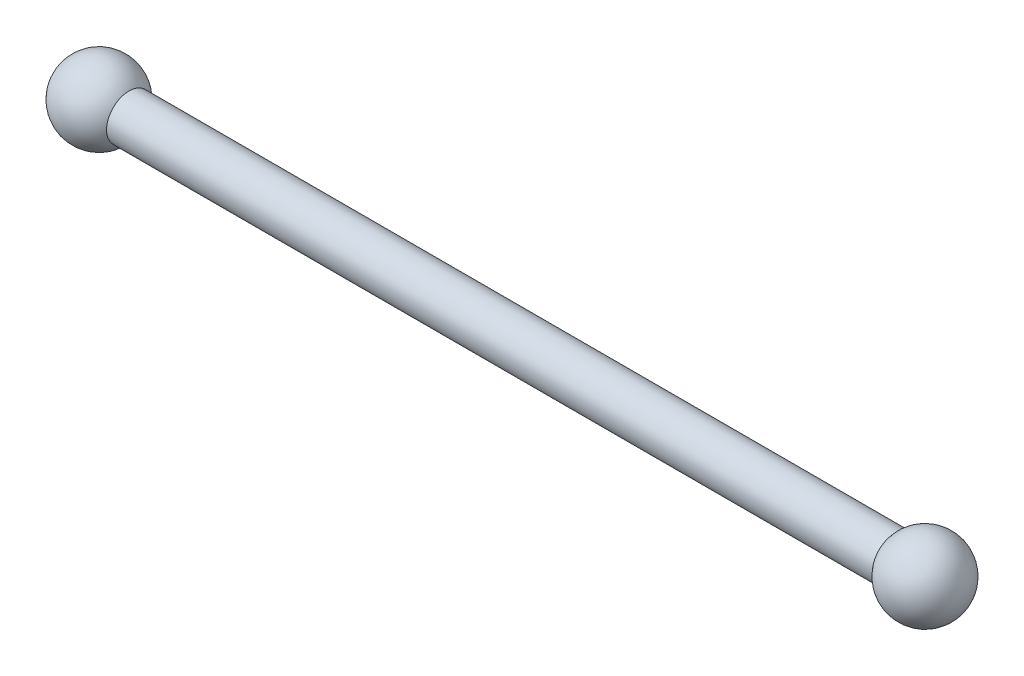
ISO-10303-21;
HEADER;
FILE_DESCRIPTION(('STEP AP214'),'2;1');
FILE_NAME('part.step','',(''),(''),'','','');
FILE_SCHEMA(('AUTOMOTIVE_DESIGN { 1 0 10303 214 1 1 1 1 }'));
ENDSEC;
DATA;
#1=APPLICATION_CONTEXT('core data for automotive mechanical design processes');
#2=APPLICATION_PROTOCOL_DEFINITION('international standard','automotive_design',2000,#1);
#3=PRODUCT_CONTEXT('',#1,'mechanical');
#4=PRODUCT('Part','Part','',(#3));
#5=PRODUCT_RELATED_PRODUCT_CATEGORY('part','',(#4));
#6=PRODUCT_DEFINITION_FORMATION('','',#4);
#7=PRODUCT_DEFINITION_CONTEXT('part definition',#1,'design');
#8=PRODUCT_DEFINITION('design','',#6,#7);
#9=PRODUCT_DEFINITION_SHAPE('','',#8);
#10=(LENGTH_UNIT() NAMED_UNIT(*) SI_UNIT(.MILLI.,.METRE.));
#11=(NAMED_UNIT(*) PLANE_ANGLE_UNIT() SI_UNIT($,.RADIAN.));
#12=(NAMED_UNIT(*) SI_UNIT($,.STERADIAN.) SOLID_ANGLE_UNIT());
#13=UNCERTAINTY_MEASURE_WITH_UNIT(LENGTH_MEASURE(1.E-05),#10,'distance_accuracy_value','');
#14=(GEOMETRIC_REPRESENTATION_CONTEXT(3) GLOBAL_UNCERTAINTY_ASSIGNED_CONTEXT((#13)) GLOBAL_UNIT_ASSIGNED_CONTEXT((#10,
#11,#12)) REPRESENTATION_CONTEXT('',''));
#15=CARTESIAN_POINT('',(0.,0.,0.));
#16=DIRECTION('',(0.,0.,1.));
#17=DIRECTION('',(1.,0.,0.));
#18=AXIS2_PLACEMENT_3D('',#15,#16,#17);
#19=CARTESIAN_POINT('',(55.,0.,-2.5));
#20=DIRECTION('',(-1.,0.,0.));
#21=DIRECTION('',(0.,0.,1.));
#22=AXIS2_PLACEMENT_3D('',#19,#20,#21);
#23=CYLINDRICAL_SURFACE('',#22,1.5);
#24=CARTESIAN_POINT('',(2.,0.,-2.5));
#25=DIRECTION('',(-1.,0.,0.));
#26=DIRECTION('',(0.,0.,1.));
#27=AXIS2_PLACEMENT_3D('',#24,#25,#26);
#28=CIRCLE('',#27,1.5);
#29=CARTESIAN_POINT('',(2.,0.,-1.));
#30=VERTEX_POINT('',#29);
#31=EDGE_CURVE('E47',#30,#30,#28,.T.);
#32=ORIENTED_EDGE('',*,*,#31,.F.);
#33=EDGE_LOOP('',(#32));
#34=FACE_BOUND('',#33,.T.);
#35=CARTESIAN_POINT('',(53.,0.,-2.5));
#36=DIRECTION('',(1.,0.,0.));
#37=DIRECTION('',(0.,0.,-1.));
#38=AXIS2_PLACEMENT_3D('',#35,#36,#37);
#39=CIRCLE('',#38,1.5);
#40=CARTESIAN_POINT('',(53.,0.,-4.));
#41=VERTEX_POINT('',#40);
#42=EDGE_CURVE('E10',#41,#41,#39,.F.);
#43=ORIENTED_EDGE('',*,*,#42,.T.);
#44=EDGE_LOOP('',(#43));
#45=FACE_BOUND('',#44,.T.);
#46=ADVANCED_FACE('F39',(#34,#45),#23,.T.);
#47=CARTESIAN_POINT('',(0.,0.,-2.5));
#48=DIRECTION('',(0.,1.,0.));
#49=DIRECTION('',(0.,0.,1.));
#50=AXIS2_PLACEMENT_3D('',#47,#48,#49);
#51=SPHERICAL_SURFACE('',#50,2.5);
#52=CARTESIAN_POINT('',(0.,0.,-2.5));
#53=DIRECTION('',(-1.,0.,0.));
#54=DIRECTION('',(0.,0.,1.));
#55=AXIS2_PLACEMENT_3D('',#52,#53,#54);
#56=SPHERICAL_SURFACE('',#55,2.5);
#57=ORIENTED_EDGE('',*,*,#31,.T.);
#58=EDGE_LOOP('',(#57));
#59=FACE_BOUND('',#58,.T.);
#60=ADVANCED_FACE('F41',(#59),#56,.T.);
#61=CARTESIAN_POINT('',(55.,0.,-2.5));
#62=DIRECTION('',(0.,1.,0.));
#63=DIRECTION('',(0.,0.,1.));
#64=AXIS2_PLACEMENT_3D('',#61,#62,#63);
#65=SPHERICAL_SURFACE('',#64,2.5);
#66=CARTESIAN_POINT('',(55.,0.,-2.5));
#67=DIRECTION('',(1.,0.,0.));
#68=DIRECTION('',(0.,0.,-1.));
#69=AXIS2_PLACEMENT_3D('',#66,#67,#68);
#70=SPHERICAL_SURFACE('',#69,2.5);
#71=ORIENTED_EDGE('',*,*,#42,.F.);
#72=EDGE_LOOP('',(#71));
#73=FACE_BOUND('',#72,.T.);
#74=ADVANCED_FACE('F59',(#73),#70,.T.);
#75=CLOSED_SHELL('',(#46,#60,#74));
#76=MANIFOLD_SOLID_BREP('B2',#75);
#77=ADVANCED_BREP_SHAPE_REPRESENTATION('',(#18,#76),#14);
#78=SHAPE_DEFINITION_REPRESENTATION(#9,#77);
ENDSEC;
END-ISO-10303-21;
